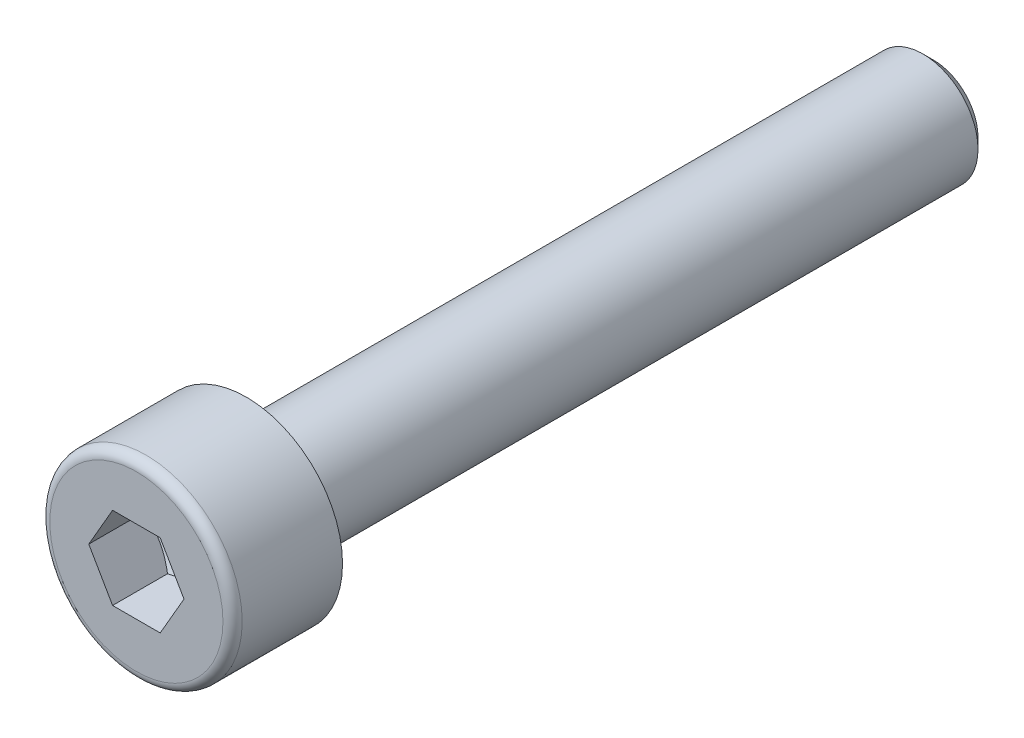
ISO-10303-21;
HEADER;
FILE_DESCRIPTION(('STEP AP214'),'2;1');
FILE_NAME('part.step','',(''),(''),'','','');
FILE_SCHEMA(('AUTOMOTIVE_DESIGN { 1 0 10303 214 1 1 1 1 }'));
ENDSEC;
DATA;
#1=APPLICATION_CONTEXT('core data for automotive mechanical design processes');
#2=APPLICATION_PROTOCOL_DEFINITION('international standard','automotive_design',2000,#1);
#3=PRODUCT_CONTEXT('',#1,'mechanical');
#4=PRODUCT('Part','Part','',(#3));
#5=PRODUCT_RELATED_PRODUCT_CATEGORY('part','',(#4));
#6=PRODUCT_DEFINITION_FORMATION('','',#4);
#7=PRODUCT_DEFINITION_CONTEXT('part definition',#1,'design');
#8=PRODUCT_DEFINITION('design','',#6,#7);
#9=PRODUCT_DEFINITION_SHAPE('','',#8);
#10=(LENGTH_UNIT() NAMED_UNIT(*) SI_UNIT(.MILLI.,.METRE.));
#11=(NAMED_UNIT(*) PLANE_ANGLE_UNIT() SI_UNIT($,.RADIAN.));
#12=(NAMED_UNIT(*) SI_UNIT($,.STERADIAN.) SOLID_ANGLE_UNIT());
#13=UNCERTAINTY_MEASURE_WITH_UNIT(LENGTH_MEASURE(1.E-05),#10,'distance_accuracy_value','');
#14=(GEOMETRIC_REPRESENTATION_CONTEXT(3) GLOBAL_UNCERTAINTY_ASSIGNED_CONTEXT((#13)) GLOBAL_UNIT_ASSIGNED_CONTEXT((#10,
#11,#12)) REPRESENTATION_CONTEXT('',''));
#15=CARTESIAN_POINT('',(0.,0.,0.));
#16=DIRECTION('',(0.,0.,1.));
#17=DIRECTION('',(1.,0.,0.));
#18=AXIS2_PLACEMENT_3D('',#15,#16,#17);
#19=CARTESIAN_POINT('',(0.,3.15,4.));
#20=DIRECTION('',(0.,0.,-1.));
#21=DIRECTION('',(-1.,0.,0.));
#22=AXIS2_PLACEMENT_3D('',#19,#20,#21);
#23=PLANE('',#22);
#24=CARTESIAN_POINT('',(0.,0.,4.));
#25=DIRECTION('',(0.,0.,1.));
#26=DIRECTION('',(1.,0.,0.));
#27=AXIS2_PLACEMENT_3D('',#24,#25,#26);
#28=CIRCLE('',#27,3.15);
#29=CARTESIAN_POINT('',(3.15,0.,4.));
#30=VERTEX_POINT('',#29);
#31=EDGE_CURVE('E125',#30,#30,#28,.T.);
#32=ORIENTED_EDGE('',*,*,#31,.T.);
#33=EDGE_LOOP('',(#32));
#34=FACE_BOUND('',#33,.T.);
#35=DIRECTION('',(0.5,-0.866025403784438,0.));
#36=VECTOR('',#35,1.);
#37=CARTESIAN_POINT('',(0.866025,1.49999930062484,4.));
#38=LINE('',#37,#36);
#39=CARTESIAN_POINT('',(0.866025,1.49999930062484,4.));
#40=VERTEX_POINT('',#39);
#41=CARTESIAN_POINT('',(1.73205,0.,4.));
#42=VERTEX_POINT('',#41);
#43=EDGE_CURVE('E31',#40,#42,#38,.T.);
#44=ORIENTED_EDGE('',*,*,#43,.T.);
#45=DIRECTION('',(-0.5,-0.866025403784439,0.));
#46=VECTOR('',#45,1.);
#47=CARTESIAN_POINT('',(1.73205,0.,4.));
#48=LINE('',#47,#46);
#49=CARTESIAN_POINT('',(0.866025,-1.49999930062484,4.));
#50=VERTEX_POINT('',#49);
#51=EDGE_CURVE('E172',#42,#50,#48,.T.);
#52=ORIENTED_EDGE('',*,*,#51,.T.);
#53=DIRECTION('',(-1.,0.,0.));
#54=VECTOR('',#53,1.);
#55=CARTESIAN_POINT('',(0.866025,-1.49999930062484,4.));
#56=LINE('',#55,#54);
#57=CARTESIAN_POINT('',(-0.866025,-1.49999930062484,4.));
#58=VERTEX_POINT('',#57);
#59=EDGE_CURVE('E177',#50,#58,#56,.T.);
#60=ORIENTED_EDGE('',*,*,#59,.T.);
#61=DIRECTION('',(-0.5,0.866025403784439,0.));
#62=VECTOR('',#61,1.);
#63=CARTESIAN_POINT('',(-0.866025,-1.49999930062484,4.));
#64=LINE('',#63,#62);
#65=CARTESIAN_POINT('',(-1.73205,0.,4.));
#66=VERTEX_POINT('',#65);
#67=EDGE_CURVE('E181',#58,#66,#64,.T.);
#68=ORIENTED_EDGE('',*,*,#67,.T.);
#69=DIRECTION('',(0.5,0.866025403784439,0.));
#70=VECTOR('',#69,1.);
#71=CARTESIAN_POINT('',(-1.73205,0.,4.));
#72=LINE('',#71,#70);
#73=CARTESIAN_POINT('',(-0.866025,1.49999930062484,4.));
#74=VERTEX_POINT('',#73);
#75=EDGE_CURVE('E103',#66,#74,#72,.T.);
#76=ORIENTED_EDGE('',*,*,#75,.T.);
#77=DIRECTION('',(1.,0.,0.));
#78=VECTOR('',#77,1.);
#79=CARTESIAN_POINT('',(-0.866025,1.49999930062484,4.));
#80=LINE('',#79,#78);
#81=EDGE_CURVE('E94',#74,#40,#80,.T.);
#82=ORIENTED_EDGE('',*,*,#81,.T.);
#83=EDGE_LOOP('',(#44,#52,#60,#68,#76,#82));
#84=FACE_BOUND('',#83,.T.);
#85=ADVANCED_FACE('F16',(#34,#84),#23,.F.);
#86=CARTESIAN_POINT('',(0.,0.,0.));
#87=DIRECTION('',(0.,0.,1.));
#88=DIRECTION('',(1.,0.,0.));
#89=AXIS2_PLACEMENT_3D('',#86,#87,#88);
#90=PLANE('',#89);
#91=CARTESIAN_POINT('',(0.,0.,0.));
#92=DIRECTION('',(0.,0.,1.));
#93=DIRECTION('',(1.,0.,0.));
#94=AXIS2_PLACEMENT_3D('',#91,#92,#93);
#95=CIRCLE('',#94,3.5);
#96=CARTESIAN_POINT('',(3.5,0.,0.));
#97=VERTEX_POINT('',#96);
#98=EDGE_CURVE('E24',#97,#97,#95,.T.);
#99=ORIENTED_EDGE('',*,*,#98,.F.);
#100=EDGE_LOOP('',(#99));
#101=FACE_BOUND('',#100,.T.);
#102=CARTESIAN_POINT('',(0.,0.,0.));
#103=DIRECTION('',(0.,0.,1.));
#104=DIRECTION('',(1.,0.,0.));
#105=AXIS2_PLACEMENT_3D('',#102,#103,#104);
#106=CIRCLE('',#105,2.);
#107=CARTESIAN_POINT('',(2.,0.,0.));
#108=VERTEX_POINT('',#107);
#109=EDGE_CURVE('E11',#108,#108,#106,.F.);
#110=ORIENTED_EDGE('',*,*,#109,.F.);
#111=EDGE_LOOP('',(#110));
#112=FACE_BOUND('',#111,.T.);
#113=ADVANCED_FACE('F140',(#101,#112),#90,.F.);
#114=CARTESIAN_POINT('',(0.,0.,4.));
#115=DIRECTION('',(0.,0.,1.));
#116=DIRECTION('',(1.,0.,0.));
#117=AXIS2_PLACEMENT_3D('',#114,#115,#116);
#118=CYLINDRICAL_SURFACE('',#117,3.5);
#119=CARTESIAN_POINT('',(0.,0.,3.65));
#120=DIRECTION('',(0.,0.,1.));
#121=DIRECTION('',(1.,0.,0.));
#122=AXIS2_PLACEMENT_3D('',#119,#120,#121);
#123=CIRCLE('',#122,3.5);
#124=CARTESIAN_POINT('',(3.5,0.,3.65));
#125=VERTEX_POINT('',#124);
#126=EDGE_CURVE('E129',#125,#125,#123,.T.);
#127=ORIENTED_EDGE('',*,*,#126,.F.);
#128=EDGE_LOOP('',(#127));
#129=FACE_BOUND('',#128,.T.);
#130=ORIENTED_EDGE('',*,*,#98,.T.);
#131=EDGE_LOOP('',(#130));
#132=FACE_BOUND('',#131,.T.);
#133=ADVANCED_FACE('F138',(#129,#132),#118,.T.);
#134=CARTESIAN_POINT('',(0.,0.,3.65));
#135=DIRECTION('',(0.,0.,1.));
#136=DIRECTION('',(1.,0.,0.));
#137=AXIS2_PLACEMENT_3D('',#134,#135,#136);
#138=TOROIDAL_SURFACE('',#137,3.15,0.35);
#139=ORIENTED_EDGE('',*,*,#31,.F.);
#140=EDGE_LOOP('',(#139));
#141=FACE_BOUND('',#140,.T.);
#142=ORIENTED_EDGE('',*,*,#126,.T.);
#143=EDGE_LOOP('',(#142));
#144=FACE_BOUND('',#143,.T.);
#145=ADVANCED_FACE('F148',(#141,#144),#138,.T.);
#146=CARTESIAN_POINT('',(0.,0.,0.));
#147=DIRECTION('',(0.,0.,1.));
#148=DIRECTION('',(1.,0.,0.));
#149=AXIS2_PLACEMENT_3D('',#146,#147,#148);
#150=CYLINDRICAL_SURFACE('',#149,2.);
#151=CARTESIAN_POINT('',(0.,0.,-24.621125));
#152=DIRECTION('',(0.,0.,1.));
#153=DIRECTION('',(1.,0.,0.));
#154=AXIS2_PLACEMENT_3D('',#151,#152,#153);
#155=CIRCLE('',#154,2.);
#156=CARTESIAN_POINT('',(2.,0.,-24.621125));
#157=VERTEX_POINT('',#156);
#158=EDGE_CURVE('E117',#157,#157,#155,.T.);
#159=ORIENTED_EDGE('',*,*,#158,.T.);
#160=EDGE_LOOP('',(#159));
#161=FACE_BOUND('',#160,.T.);
#162=ORIENTED_EDGE('',*,*,#109,.T.);
#163=EDGE_LOOP('',(#162));
#164=FACE_BOUND('',#163,.T.);
#165=ADVANCED_FACE('F145',(#161,#164),#150,.T.);
#166=CARTESIAN_POINT('',(0.,0.,-25.));
#167=DIRECTION('',(0.,0.,1.));
#168=DIRECTION('',(1.,0.,0.));
#169=AXIS2_PLACEMENT_3D('',#166,#167,#168);
#170=PLANE('',#169);
#171=CARTESIAN_POINT('',(0.,0.,-25.));
#172=DIRECTION('',(0.,0.,1.));
#173=DIRECTION('',(1.,0.,0.));
#174=AXIS2_PLACEMENT_3D('',#171,#172,#173);
#175=CIRCLE('',#174,1.621125);
#176=CARTESIAN_POINT('',(1.621125,0.,-25.));
#177=VERTEX_POINT('',#176);
#178=EDGE_CURVE('E121',#177,#177,#175,.T.);
#179=ORIENTED_EDGE('',*,*,#178,.F.);
#180=EDGE_LOOP('',(#179));
#181=FACE_BOUND('',#180,.T.);
#182=ADVANCED_FACE('F147',(#181),#170,.F.);
#183=CARTESIAN_POINT('',(0.,0.,-25.));
#184=DIRECTION('',(0.,0.,1.));
#185=DIRECTION('',(1.,0.,0.));
#186=AXIS2_PLACEMENT_3D('',#183,#184,#185);
#187=CONICAL_SURFACE('',#186,1.621125,0.785398163397448);
#188=ORIENTED_EDGE('',*,*,#158,.F.);
#189=EDGE_LOOP('',(#188));
#190=FACE_BOUND('',#189,.T.);
#191=ORIENTED_EDGE('',*,*,#178,.T.);
#192=EDGE_LOOP('',(#191));
#193=FACE_BOUND('',#192,.T.);
#194=ADVANCED_FACE('F156',(#190,#193),#187,.T.);
#195=CARTESIAN_POINT('',(0.866025,1.49999930062484,1.00000046625011));
#196=DIRECTION('',(-0.866025403784438,-0.5,0.));
#197=DIRECTION('',(-0.5,0.866025403784438,0.));
#198=AXIS2_PLACEMENT_3D('',#195,#196,#197);
#199=PLANE('',#198);
#200=DIRECTION('',(0.,0.,1.));
#201=VECTOR('',#200,1.);
#202=CARTESIAN_POINT('',(1.73205,0.,1.00000046625011));
#203=LINE('',#202,#201);
#204=CARTESIAN_POINT('',(1.73205,0.,2.));
#205=VERTEX_POINT('',#204);
#206=EDGE_CURVE('E115',#205,#42,#203,.T.);
#207=ORIENTED_EDGE('',*,*,#206,.T.);
#208=ORIENTED_EDGE('',*,*,#43,.F.);
#209=DIRECTION('',(0.,0.,1.));
#210=VECTOR('',#209,1.);
#211=CARTESIAN_POINT('',(0.866025,1.49999930062484,1.00000046625011));
#212=LINE('',#211,#210);
#213=CARTESIAN_POINT('',(0.866025,1.49999930062484,2.));
#214=VERTEX_POINT('',#213);
#215=EDGE_CURVE('E87',#214,#40,#212,.T.);
#216=ORIENTED_EDGE('',*,*,#215,.F.);
#217=CARTESIAN_POINT('',(1.73205115470054,-2.E-06,2.00000066666734));
#218=CARTESIAN_POINT('',(1.69399458130122,0.0659139186895892,1.97802228100261));
#219=CARTESIAN_POINT('',(1.65560950414464,0.132398822577242,1.95803408114054));
#220=CARTESIAN_POINT('',(1.57817473630843,0.266519774741864,1.92314525941874));
#221=CARTESIAN_POINT('',(1.53912367019894,0.334158205333232,1.90825697858766));
#222=CARTESIAN_POINT('',(1.46150547885139,0.468596856338784,1.88508226983918));
#223=CARTESIAN_POINT('',(1.42295029290091,0.535376397300293,1.87664158385231));
#224=CARTESIAN_POINT('',(1.34565859846878,0.669249539059823,1.86656700525616));
#225=CARTESIAN_POINT('',(1.30692237073331,0.736342653591208,1.86492476807133));
#226=CARTESIAN_POINT('',(1.23454773253413,0.861699204131607,1.86834969801067));
#227=CARTESIAN_POINT('',(1.20089846229767,0.919981449818777,1.87257593125167));
#228=CARTESIAN_POINT('',(1.1338191361032,1.03616625092508,1.88596796669928));
#229=CARTESIAN_POINT('',(1.10038931198579,1.09406840478452,1.89513833923059));
#230=CARTESIAN_POINT('',(1.03317179328088,1.21049256234014,1.91806252128818));
#231=CARTESIAN_POINT('',(0.999392601793287,1.26899983823525,1.93191346069662));
#232=CARTESIAN_POINT('',(0.932337893068965,1.38514200063251,1.96334924731355));
#233=CARTESIAN_POINT('',(0.89906151743008,1.4427783739308,1.980926712986));
#234=CARTESIAN_POINT('',(0.866023845299461,1.50000130062484,2.00000066666734));
#235=B_SPLINE_CURVE_WITH_KNOTS('',3,(#217,#218,#219,#220,#221,#222,#223,#224,#225,#226,#227,
#228,#229,#230,#231,#232,#233,#234),.UNSPECIFIED.,.F.,.F.,(4,2,2,2,2,2,2,2,4),(0.,
0.237762055931485,0.476095461361748,0.708530837844131,0.94068083294838,1.14278193102308,
1.34507017093339,1.55184422617205,1.75821246569164),.UNSPECIFIED.);
#236=EDGE_CURVE('E79',#205,#214,#235,.T.);
#237=ORIENTED_EDGE('',*,*,#236,.F.);
#238=EDGE_LOOP('',(#207,#208,#216,#237));
#239=FACE_BOUND('',#238,.T.);
#240=ADVANCED_FACE('F88',(#239),#199,.T.);
#241=CARTESIAN_POINT('',(1.73205,0.,1.00000046625011));
#242=DIRECTION('',(-0.866025403784439,0.5,0.));
#243=DIRECTION('',(0.5,0.866025403784439,0.));
#244=AXIS2_PLACEMENT_3D('',#241,#242,#243);
#245=PLANE('',#244);
#246=DIRECTION('',(0.,0.,1.));
#247=VECTOR('',#246,1.);
#248=CARTESIAN_POINT('',(0.866025,-1.49999930062484,1.00000046625011));
#249=LINE('',#248,#247);
#250=CARTESIAN_POINT('',(0.866025,-1.49999930062484,2.));
#251=VERTEX_POINT('',#250);
#252=EDGE_CURVE('E112',#251,#50,#249,.T.);
#253=ORIENTED_EDGE('',*,*,#252,.T.);
#254=ORIENTED_EDGE('',*,*,#51,.F.);
#255=ORIENTED_EDGE('',*,*,#206,.F.);
#256=CARTESIAN_POINT('',(0.866023845299462,-1.50000130062484,2.00000066666734));
#257=CARTESIAN_POINT('',(0.904080418698778,-1.43408538193525,1.9780222810026));
#258=CARTESIAN_POINT('',(0.942465495855361,-1.36760047804759,1.95803408114054));
#259=CARTESIAN_POINT('',(1.01990026369157,-1.23347952588297,1.92314525941874));
#260=CARTESIAN_POINT('',(1.05895132980106,-1.1658410952916,1.90825697858766));
#261=CARTESIAN_POINT('',(1.13656952114861,-1.03140244428605,1.88508226983918));
#262=CARTESIAN_POINT('',(1.1751247070991,-0.964622903324544,1.87664158385231));
#263=CARTESIAN_POINT('',(1.25241640153122,-0.830749761565014,1.86656700525616));
#264=CARTESIAN_POINT('',(1.29115262926669,-0.763656647033629,1.86492476807133));
#265=CARTESIAN_POINT('',(1.36352726746587,-0.638300096493229,1.86834969801067));
#266=CARTESIAN_POINT('',(1.39717653770233,-0.58001785080606,1.87257593125166));
#267=CARTESIAN_POINT('',(1.4642558638968,-0.463833049699756,1.88596796669928));
#268=CARTESIAN_POINT('',(1.49768568801421,-0.405930895840313,1.89513833923059));
#269=CARTESIAN_POINT('',(1.56490320671912,-0.2895067382847,1.91806252128818));
#270=CARTESIAN_POINT('',(1.59868239820671,-0.230999462389588,1.93191346069662));
#271=CARTESIAN_POINT('',(1.66573710693103,-0.11485729999233,1.96334924731355));
#272=CARTESIAN_POINT('',(1.69901348256992,-0.0572209266940348,1.980926712986));
#273=CARTESIAN_POINT('',(1.73205115470054,1.99999999979098E-06,2.00000066666734));
#274=B_SPLINE_CURVE_WITH_KNOTS('',3,(#256,#257,#258,#259,#260,#261,#262,#263,#264,#265,#266,
#267,#268,#269,#270,#271,#272,#273),.UNSPECIFIED.,.F.,.F.,(4,2,2,2,2,2,2,2,4),(0.,
0.237762055931484,0.476095461361747,0.708530837844129,0.940680832948377,1.14278193102307,
1.34507017093338,1.55184422617205,1.75821246569164),.UNSPECIFIED.);
#275=EDGE_CURVE('E83',#251,#205,#274,.T.);
#276=ORIENTED_EDGE('',*,*,#275,.F.);
#277=EDGE_LOOP('',(#253,#254,#255,#276));
#278=FACE_BOUND('',#277,.T.);
#279=ADVANCED_FACE('F237',(#278),#245,.T.);
#280=CARTESIAN_POINT('',(0.866025,-1.49999930062484,1.00000046625011));
#281=DIRECTION('',(0.,1.,0.));
#282=DIRECTION('',(1.,0.,0.));
#283=AXIS2_PLACEMENT_3D('',#280,#281,#282);
#284=PLANE('',#283);
#285=DIRECTION('',(0.,0.,1.));
#286=VECTOR('',#285,1.);
#287=CARTESIAN_POINT('',(-0.866025,-1.49999930062484,1.00000046625011));
#288=LINE('',#287,#286);
#289=CARTESIAN_POINT('',(-0.866025,-1.49999930062484,2.));
#290=VERTEX_POINT('',#289);
#291=EDGE_CURVE('E109',#290,#58,#288,.T.);
#292=ORIENTED_EDGE('',*,*,#291,.T.);
#293=ORIENTED_EDGE('',*,*,#59,.F.);
#294=ORIENTED_EDGE('',*,*,#252,.F.);
#295=CARTESIAN_POINT('',(-2.24271663728987,-1.49999930062484,2.55775267344395));
#296=CARTESIAN_POINT('',(-2.17794141332338,-1.49999930062484,2.52667596135368));
#297=CARTESIAN_POINT('',(-2.11300852130655,-1.49999930062484,2.49592211621229));
#298=CARTESIAN_POINT('',(-1.98274303131292,-1.49999930062484,2.43524311162405));
#299=CARTESIAN_POINT('',(-1.91741036395219,-1.49999930062484,2.40531810131238));
#300=CARTESIAN_POINT('',(-1.78588635397686,-1.49999930062484,2.34631254095844));
#301=CARTESIAN_POINT('',(-1.71969220663993,-1.49999930062484,2.31723821458641));
#302=CARTESIAN_POINT('',(-1.58674953026847,-1.49999930062484,2.26039396688304));
#303=CARTESIAN_POINT('',(-1.52000103027226,-1.49999930062484,2.23262397772829));
#304=CARTESIAN_POINT('',(-1.38408036083489,-1.49999930062484,2.17802545642731));
#305=CARTESIAN_POINT('',(-1.31489044686774,-1.49999930062484,2.1512405113674));
#306=CARTESIAN_POINT('',(-1.17568875836751,-1.49999930062484,2.09990652822181));
#307=CARTESIAN_POINT('',(-1.10567688208708,-1.49999930062484,2.07535777031023));
#308=CARTESIAN_POINT('',(-0.894522216300188,-1.49999930062484,2.0061010834001));
#309=CARTESIAN_POINT('',(-0.751873977094198,-1.49999930062484,1.9656202744164));
#310=CARTESIAN_POINT('',(-0.535047450977606,-1.49999930062484,1.9186645261203));
#311=CARTESIAN_POINT('',(-0.462365424606466,-1.49999930062484,1.90531291688069));
#312=CARTESIAN_POINT('',(-0.316183762847225,-1.49999930062484,1.8841134767258));
#313=CARTESIAN_POINT('',(-0.242684183051902,-1.49999930062484,1.87626527388084));
#314=CARTESIAN_POINT('',(-0.0961588910059515,-1.49999930062484,1.86679859934064));
#315=CARTESIAN_POINT('',(-0.0231380525234333,-1.49999930062484,1.86510661239957));
#316=CARTESIAN_POINT('',(0.122783022434076,-1.49999930062484,1.86789948707645));
#317=CARTESIAN_POINT('',(0.195683251161583,-1.49999930062484,1.8723847311637));
#318=CARTESIAN_POINT('',(0.375553746438775,-1.49999930062484,1.89067768491976));
#319=CARTESIAN_POINT('',(0.4821754471692,-1.49999930062484,1.90791354190592));
#320=CARTESIAN_POINT('',(0.693345462539466,-1.49999930062484,1.95235984396466));
#321=CARTESIAN_POINT('',(0.79789111749796,-1.49999930062484,1.97958231080908));
#322=CARTESIAN_POINT('',(0.954250638010105,-1.49999930062484,2.02608493590371));
#323=CARTESIAN_POINT('',(1.00687274480645,-1.49999930062484,2.04274751774646));
#324=CARTESIAN_POINT('',(1.11156919647057,-1.49999930062484,2.07761406562061));
#325=CARTESIAN_POINT('',(1.16364386068557,-1.49999930062484,2.09581706970924));
#326=CARTESIAN_POINT('',(1.26731501755411,-1.49999930062484,2.13350010092581));
#327=CARTESIAN_POINT('',(1.31891159517315,-1.49999930062484,2.15297989597396));
#328=CARTESIAN_POINT('',(1.42169818698628,-1.49999930062484,2.19300580386973));
#329=CARTESIAN_POINT('',(1.47288813079445,-1.49999930062484,2.21355209687612));
#330=CARTESIAN_POINT('',(1.6035520536722,-1.49999930062484,2.26731329701247));
#331=CARTESIAN_POINT('',(1.68276476914258,-1.49999930062484,2.30116251352867));
#332=CARTESIAN_POINT('',(1.84047488481565,-1.49999930062484,2.37049266735));
#333=CARTESIAN_POINT('',(1.9189722309026,-1.49999930062484,2.40597372689195));
#334=CARTESIAN_POINT('',(2.15362957255391,-1.49999930062484,2.51428942992019));
#335=CARTESIAN_POINT('',(2.3089286607519,-1.49999930062484,2.58898549353906));
#336=CARTESIAN_POINT('',(2.61820006623532,-1.49999930062484,2.74151036059574));
#337=CARTESIAN_POINT('',(2.77217051778771,-1.49999930062484,2.81934290231597));
#338=CARTESIAN_POINT('',(3.07905650209162,-1.49999930062484,2.97700931547993));
#339=CARTESIAN_POINT('',(3.23197216581148,-1.49999930062484,3.05684293253984));
#340=CARTESIAN_POINT('',(3.52267476728495,-1.49999930062484,3.21028853935711));
#341=CARTESIAN_POINT('',(3.66052737206612,-1.49999930062484,3.28377655462836));
#342=CARTESIAN_POINT('',(3.93578914881928,-1.49999930062484,3.43158990958268));
#343=CARTESIAN_POINT('',(4.07319830413762,-1.49999930062484,3.50591528025237));
#344=CARTESIAN_POINT('',(4.34732590427536,-1.49999930062483,3.65500351537988));
#345=CARTESIAN_POINT('',(4.48404521696312,-1.49999930062483,3.72976478622522));
#346=CARTESIAN_POINT('',(4.75720742747683,-1.49999930062483,3.87977391809883));
#347=CARTESIAN_POINT('',(4.89365033939364,-1.49999930062484,3.9550217534582));
#348=CARTESIAN_POINT('',(5.02999394665514,-1.49999930062484,4.03044801324502));
#349=B_SPLINE_CURVE_WITH_KNOTS('',3,(#295,#296,#297,#298,#299,#300,#301,#302,#303,#304,#305,
#306,#307,#308,#309,#310,#311,#312,#313,#314,#315,#316,#317,#318,#319,#320,#321,#322,#323,#324,
#325,#326,#327,#328,#329,#330,#331,#332,#333,#334,#335,#336,#337,#338,#339,#340,#341,#342,#343,
#344,#345,#346,#347,#348),.UNSPECIFIED.,.F.,.F.,(4,2,2,2,2,2,2,2,2,2,2,2,2,2,2,2,2,2,2,2,2,2,2,
2,2,2,4),(0.,0.215535408976475,0.431109351318747,0.647990972858705,0.864861304394723,
1.08740082372431,1.30996818700982,1.75384735851117,1.97537373294937,2.19688513480997,
2.41574248382684,2.63461338422016,2.95796620171825,3.28170955197757,3.44728283297626,
3.61275347131505,3.77819411534645,3.94366279806486,4.20206179692704,4.46048018336434,
4.97740230798824,5.49495989978084,6.01245202818902,6.48110050133562,6.94976637432356,
7.41724019162004,7.88468954517039),.UNSPECIFIED.);
#350=EDGE_CURVE('E225',#290,#251,#349,.T.);
#351=ORIENTED_EDGE('',*,*,#350,.F.);
#352=EDGE_LOOP('',(#292,#293,#294,#351));
#353=FACE_BOUND('',#352,.T.);
#354=ADVANCED_FACE('F232',(#353),#284,.T.);
#355=CARTESIAN_POINT('',(-0.866025,-1.49999930062484,1.00000046625011));
#356=DIRECTION('',(0.866025403784439,0.5,0.));
#357=DIRECTION('',(0.5,-0.866025403784439,0.));
#358=AXIS2_PLACEMENT_3D('',#355,#356,#357);
#359=PLANE('',#358);
#360=DIRECTION('',(0.,0.,1.));
#361=VECTOR('',#360,1.);
#362=CARTESIAN_POINT('',(-1.73205,0.,1.00000046625011));
#363=LINE('',#362,#361);
#364=CARTESIAN_POINT('',(-1.73205,0.,2.));
#365=VERTEX_POINT('',#364);
#366=EDGE_CURVE('E100',#365,#66,#363,.T.);
#367=ORIENTED_EDGE('',*,*,#366,.T.);
#368=ORIENTED_EDGE('',*,*,#67,.F.);
#369=ORIENTED_EDGE('',*,*,#291,.F.);
#370=CARTESIAN_POINT('',(-1.73205115470054,1.99999999935948E-06,2.00000066666734));
#371=CARTESIAN_POINT('',(-1.69399458130122,-0.0659139186895897,1.97802228100261));
#372=CARTESIAN_POINT('',(-1.65560950414464,-0.132398822577242,1.95803408114054));
#373=CARTESIAN_POINT('',(-1.57817473630843,-0.266519774741865,1.92314525941874));
#374=CARTESIAN_POINT('',(-1.53912367019894,-0.334158205333233,1.90825697858766));
#375=CARTESIAN_POINT('',(-1.46150547885139,-0.468596856338785,1.88508226983918));
#376=CARTESIAN_POINT('',(-1.4229502929009,-0.535376397300293,1.87664158385231));
#377=CARTESIAN_POINT('',(-1.34565859846878,-0.669249539059823,1.86656700525616));
#378=CARTESIAN_POINT('',(-1.30692237073331,-0.736342653591209,1.86492476807133));
#379=CARTESIAN_POINT('',(-1.23454773253413,-0.861699204131608,1.86834969801067));
#380=CARTESIAN_POINT('',(-1.20089846229767,-0.919981449818777,1.87257593125166));
#381=CARTESIAN_POINT('',(-1.1338191361032,-1.03616625092508,1.88596796669928));
#382=CARTESIAN_POINT('',(-1.10038931198579,-1.09406840478452,1.89513833923059));
#383=CARTESIAN_POINT('',(-1.03317179328088,-1.21049256234014,1.91806252128818));
#384=CARTESIAN_POINT('',(-0.999392601793289,-1.26899983823525,1.93191346069662));
#385=CARTESIAN_POINT('',(-0.932337893068967,-1.38514200063251,1.96334924731355));
#386=CARTESIAN_POINT('',(-0.899061517430081,-1.4427783739308,1.980926712986));
#387=CARTESIAN_POINT('',(-0.866023845299461,-1.50000130062484,2.00000066666734));
#388=B_SPLINE_CURVE_WITH_KNOTS('',3,(#370,#371,#372,#373,#374,#375,#376,#377,#378,#379,#380,
#381,#382,#383,#384,#385,#386,#387),.UNSPECIFIED.,.F.,.F.,(4,2,2,2,2,2,2,2,4),(0.,
0.237762055931485,0.476095461361749,0.708530837844132,0.94068083294838,1.14278193102308,
1.34507017093338,1.55184422617205,1.75821246569164),.UNSPECIFIED.);
#389=EDGE_CURVE('E218',#365,#290,#388,.T.);
#390=ORIENTED_EDGE('',*,*,#389,.F.);
#391=EDGE_LOOP('',(#367,#368,#369,#390));
#392=FACE_BOUND('',#391,.T.);
#393=ADVANCED_FACE('F201',(#392),#359,.T.);
#394=CARTESIAN_POINT('',(-1.73205,0.,1.00000046625011));
#395=DIRECTION('',(0.866025403784439,-0.5,0.));
#396=DIRECTION('',(-0.5,-0.866025403784439,0.));
#397=AXIS2_PLACEMENT_3D('',#394,#395,#396);
#398=PLANE('',#397);
#399=DIRECTION('',(0.,0.,1.));
#400=VECTOR('',#399,1.);
#401=CARTESIAN_POINT('',(-0.866025,1.49999930062484,1.00000046625011));
#402=LINE('',#401,#400);
#403=CARTESIAN_POINT('',(-0.866025,1.49999930062484,2.));
#404=VERTEX_POINT('',#403);
#405=EDGE_CURVE('E93',#404,#74,#402,.T.);
#406=ORIENTED_EDGE('',*,*,#405,.T.);
#407=ORIENTED_EDGE('',*,*,#75,.F.);
#408=ORIENTED_EDGE('',*,*,#366,.F.);
#409=CARTESIAN_POINT('',(-0.866023845299462,1.50000130062484,2.00000066666734));
#410=CARTESIAN_POINT('',(-0.904080418698778,1.43408538193525,1.9780222810026));
#411=CARTESIAN_POINT('',(-0.942465495855361,1.36760047804759,1.95803408114054));
#412=CARTESIAN_POINT('',(-1.01990026369157,1.23347952588297,1.92314525941874));
#413=CARTESIAN_POINT('',(-1.05895132980106,1.1658410952916,1.90825697858766));
#414=CARTESIAN_POINT('',(-1.13656952114861,1.03140244428605,1.88508226983918));
#415=CARTESIAN_POINT('',(-1.1751247070991,0.964622903324544,1.87664158385231));
#416=CARTESIAN_POINT('',(-1.25241640153122,0.830749761565014,1.86656700525616));
#417=CARTESIAN_POINT('',(-1.29115262926669,0.763656647033629,1.86492476807133));
#418=CARTESIAN_POINT('',(-1.36352726746587,0.638300096493229,1.86834969801067));
#419=CARTESIAN_POINT('',(-1.39717653770233,0.58001785080606,1.87257593125166));
#420=CARTESIAN_POINT('',(-1.4642558638968,0.463833049699756,1.88596796669928));
#421=CARTESIAN_POINT('',(-1.49768568801421,0.405930895840313,1.89513833923059));
#422=CARTESIAN_POINT('',(-1.56490320671912,0.289506738284699,1.91806252128818));
#423=CARTESIAN_POINT('',(-1.59868239820671,0.230999462389588,1.93191346069662));
#424=CARTESIAN_POINT('',(-1.66573710693103,0.11485729999233,1.96334924731355));
#425=CARTESIAN_POINT('',(-1.69901348256992,0.0572209266940344,1.980926712986));
#426=CARTESIAN_POINT('',(-1.73205115470054,-2.00000000048508E-06,2.00000066666734));
#427=B_SPLINE_CURVE_WITH_KNOTS('',3,(#409,#410,#411,#412,#413,#414,#415,#416,#417,#418,#419,
#420,#421,#422,#423,#424,#425,#426),.UNSPECIFIED.,.F.,.F.,(4,2,2,2,2,2,2,2,4),(0.,
0.237762055931484,0.476095461361747,0.708530837844129,0.940680832948377,1.14278193102307,
1.34507017093338,1.55184422617205,1.75821246569164),.UNSPECIFIED.);
#428=EDGE_CURVE('E39',#404,#365,#427,.T.);
#429=ORIENTED_EDGE('',*,*,#428,.F.);
#430=EDGE_LOOP('',(#406,#407,#408,#429));
#431=FACE_BOUND('',#430,.T.);
#432=ADVANCED_FACE('F195',(#431),#398,.T.);
#433=CARTESIAN_POINT('',(-0.866025,1.49999930062484,1.00000046625011));
#434=DIRECTION('',(0.,-1.,0.));
#435=DIRECTION('',(-1.,0.,0.));
#436=AXIS2_PLACEMENT_3D('',#433,#434,#435);
#437=PLANE('',#436);
#438=ORIENTED_EDGE('',*,*,#215,.T.);
#439=ORIENTED_EDGE('',*,*,#81,.F.);
#440=ORIENTED_EDGE('',*,*,#405,.F.);
#441=CARTESIAN_POINT('',(-2.24271663728987,1.49999930062484,2.55775267344395));
#442=CARTESIAN_POINT('',(-2.17794141332338,1.49999930062484,2.52667596135368));
#443=CARTESIAN_POINT('',(-2.11300852130655,1.49999930062484,2.49592211621229));
#444=CARTESIAN_POINT('',(-1.98274303131292,1.49999930062484,2.43524311162405));
#445=CARTESIAN_POINT('',(-1.91741036395219,1.49999930062484,2.40531810131238));
#446=CARTESIAN_POINT('',(-1.78588635397687,1.49999930062484,2.34631254095844));
#447=CARTESIAN_POINT('',(-1.71969220663993,1.49999930062484,2.31723821458641));
#448=CARTESIAN_POINT('',(-1.58674953026847,1.49999930062484,2.26039396688304));
#449=CARTESIAN_POINT('',(-1.52000103027226,1.49999930062484,2.23262397772829));
#450=CARTESIAN_POINT('',(-1.3840803608349,1.49999930062484,2.17802545642731));
#451=CARTESIAN_POINT('',(-1.31489044686775,1.49999930062484,2.1512405113674));
#452=CARTESIAN_POINT('',(-1.17568875836751,1.49999930062484,2.09990652822181));
#453=CARTESIAN_POINT('',(-1.10567688208708,1.49999930062484,2.07535777031023));
#454=CARTESIAN_POINT('',(-0.894522216300189,1.49999930062484,2.0061010834001));
#455=CARTESIAN_POINT('',(-0.751873977094199,1.49999930062484,1.9656202744164));
#456=CARTESIAN_POINT('',(-0.535047450977607,1.49999930062484,1.9186645261203));
#457=CARTESIAN_POINT('',(-0.462365424606467,1.49999930062484,1.90531291688069));
#458=CARTESIAN_POINT('',(-0.316183762847226,1.49999930062484,1.8841134767258));
#459=CARTESIAN_POINT('',(-0.242684183051903,1.49999930062484,1.87626527388084));
#460=CARTESIAN_POINT('',(-0.0961588910059524,1.49999930062484,1.86679859934064));
#461=CARTESIAN_POINT('',(-0.0231380525234342,1.49999930062484,1.86510661239957));
#462=CARTESIAN_POINT('',(0.122783022434075,1.49999930062484,1.86789948707645));
#463=CARTESIAN_POINT('',(0.195683251161582,1.49999930062484,1.8723847311637));
#464=CARTESIAN_POINT('',(0.375553746438774,1.49999930062484,1.89067768491976));
#465=CARTESIAN_POINT('',(0.482175447169199,1.49999930062484,1.90791354190592));
#466=CARTESIAN_POINT('',(0.693345462539464,1.49999930062484,1.95235984396466));
#467=CARTESIAN_POINT('',(0.797891117497957,1.49999930062484,1.97958231080908));
#468=CARTESIAN_POINT('',(0.954250638010102,1.49999930062484,2.02608493590371));
#469=CARTESIAN_POINT('',(1.00687274480645,1.49999930062484,2.04274751774646));
#470=CARTESIAN_POINT('',(1.11156919647056,1.49999930062484,2.07761406562061));
#471=CARTESIAN_POINT('',(1.16364386068556,1.49999930062484,2.09581706970924));
#472=CARTESIAN_POINT('',(1.2673150175541,1.49999930062484,2.13350010092581));
#473=CARTESIAN_POINT('',(1.31891159517315,1.49999930062484,2.15297989597396));
#474=CARTESIAN_POINT('',(1.42169818698628,1.49999930062484,2.19300580386972));
#475=CARTESIAN_POINT('',(1.47288813079445,1.49999930062484,2.21355209687612));
#476=CARTESIAN_POINT('',(1.60355205367219,1.49999930062484,2.26731329701247));
#477=CARTESIAN_POINT('',(1.68276476914257,1.49999930062484,2.30116251352867));
#478=CARTESIAN_POINT('',(1.84047488481565,1.49999930062484,2.37049266735));
#479=CARTESIAN_POINT('',(1.91897223090259,1.49999930062484,2.40597372689195));
#480=CARTESIAN_POINT('',(2.15362957255391,1.49999930062484,2.51428942992019));
#481=CARTESIAN_POINT('',(2.30892866075189,1.49999930062484,2.58898549353906));
#482=CARTESIAN_POINT('',(2.61820006623532,1.49999930062484,2.74151036059574));
#483=CARTESIAN_POINT('',(2.77217051778771,1.49999930062484,2.81934290231597));
#484=CARTESIAN_POINT('',(3.07905650209162,1.49999930062484,2.97700931547993));
#485=CARTESIAN_POINT('',(3.23197216581148,1.49999930062484,3.05684293253984));
#486=CARTESIAN_POINT('',(3.52267476728495,1.49999930062484,3.21028853935711));
#487=CARTESIAN_POINT('',(3.66052737206611,1.49999930062484,3.28377655462836));
#488=CARTESIAN_POINT('',(3.93578914881928,1.49999930062484,3.43158990958268));
#489=CARTESIAN_POINT('',(4.07319830413762,1.49999930062484,3.50591528025237));
#490=CARTESIAN_POINT('',(4.34732590427536,1.49999930062484,3.65500351537988));
#491=CARTESIAN_POINT('',(4.48404521696312,1.49999930062484,3.72976478622523));
#492=CARTESIAN_POINT('',(4.75720742747683,1.49999930062484,3.87977391809883));
#493=CARTESIAN_POINT('',(4.89365033939364,1.49999930062484,3.9550217534582));
#494=CARTESIAN_POINT('',(5.02999394665514,1.49999930062484,4.03044801324502));
#495=B_SPLINE_CURVE_WITH_KNOTS('',3,(#441,#442,#443,#444,#445,#446,#447,#448,#449,#450,#451,
#452,#453,#454,#455,#456,#457,#458,#459,#460,#461,#462,#463,#464,#465,#466,#467,#468,#469,#470,
#471,#472,#473,#474,#475,#476,#477,#478,#479,#480,#481,#482,#483,#484,#485,#486,#487,#488,#489,
#490,#491,#492,#493,#494),.UNSPECIFIED.,.F.,.F.,(4,2,2,2,2,2,2,2,2,2,2,2,2,2,2,2,2,2,2,2,2,2,2,
2,2,2,4),(0.,0.215535408976474,0.431109351318746,0.647990972858704,0.864861304394721,
1.0874008237243,1.30996818700982,1.75384735851117,1.97537373294937,2.19688513480997,
2.41574248382684,2.63461338422015,2.95796620171825,3.28170955197757,3.44728283297626,
3.61275347131505,3.77819411534645,3.94366279806485,4.20206179692704,4.46048018336433,
4.97740230798824,5.49495989978084,6.01245202818902,6.48110050133561,6.94976637432355,
7.41724019162004,7.88468954517039),.UNSPECIFIED.);
#496=EDGE_CURVE('E80',#214,#404,#495,.F.);
#497=ORIENTED_EDGE('',*,*,#496,.F.);
#498=EDGE_LOOP('',(#438,#439,#440,#497));
#499=FACE_BOUND('',#498,.T.);
#500=ADVANCED_FACE('F75',(#499),#437,.T.);
#501=CARTESIAN_POINT('',(0.,0.,1.00000046625011));
#502=DIRECTION('',(0.,0.,1.));
#503=DIRECTION('',(1.,0.,0.));
#504=AXIS2_PLACEMENT_3D('',#501,#502,#503);
#505=CONICAL_SURFACE('',#504,0.,1.0471975511966);
#506=CARTESIAN_POINT('',(0.,0.,1.00000046625011));
#507=VERTEX_POINT('',#506);
#508=VERTEX_LOOP('',#507);
#509=FACE_BOUND('',#508,.T.);
#510=ORIENTED_EDGE('',*,*,#236,.T.);
#511=ORIENTED_EDGE('',*,*,#496,.T.);
#512=ORIENTED_EDGE('',*,*,#428,.T.);
#513=ORIENTED_EDGE('',*,*,#389,.T.);
#514=ORIENTED_EDGE('',*,*,#350,.T.);
#515=ORIENTED_EDGE('',*,*,#275,.T.);
#516=EDGE_LOOP('',(#510,#511,#512,#513,#514,#515));
#517=FACE_BOUND('',#516,.T.);
#518=ADVANCED_FACE('F72',(#509,#517),#505,.F.);
#519=CLOSED_SHELL('',(#85,#113,#133,#145,#165,#182,#194,#240,#279,#354,#393,#432,#500,#518));
#520=MANIFOLD_SOLID_BREP('B1',#519);
#521=ADVANCED_BREP_SHAPE_REPRESENTATION('',(#18,#520),#14);
#522=SHAPE_DEFINITION_REPRESENTATION(#9,#521);
ENDSEC;
END-ISO-10303-21;
